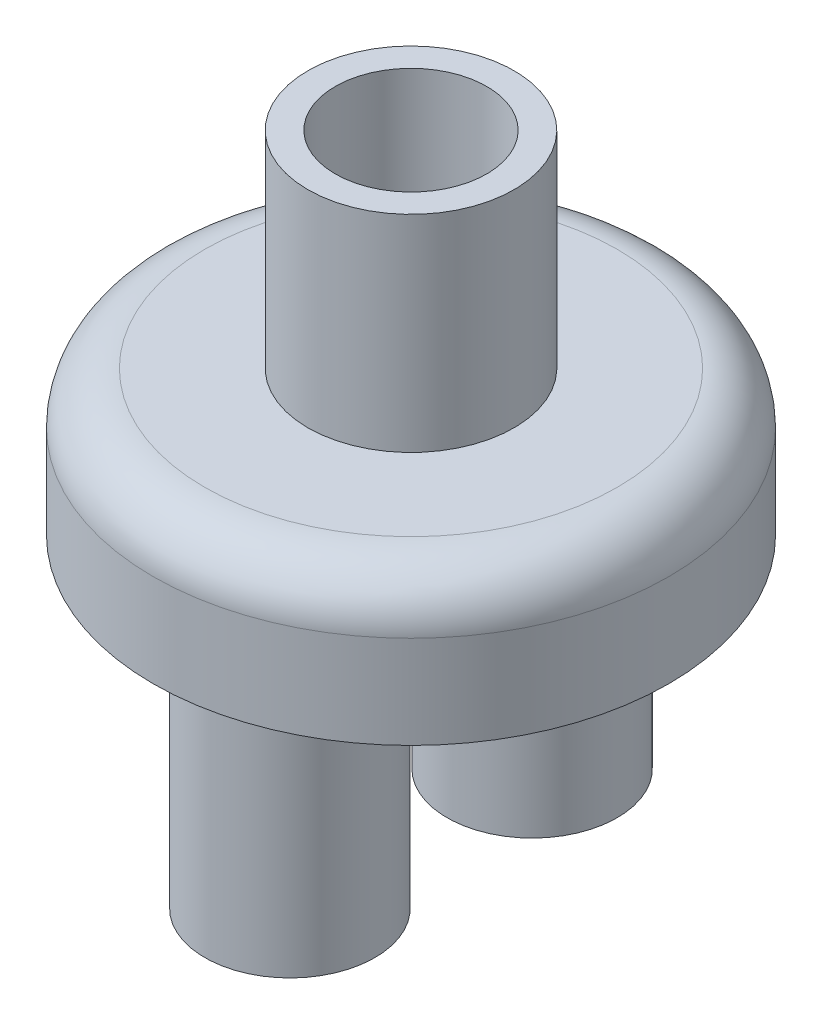
ISO-10303-21;
HEADER;
FILE_DESCRIPTION(('STEP AP214'),'2;1');
FILE_NAME('part.step','',(''),(''),'','','');
FILE_SCHEMA(('AUTOMOTIVE_DESIGN { 1 0 10303 214 1 1 1 1 }'));
ENDSEC;
DATA;
#1=APPLICATION_CONTEXT('core data for automotive mechanical design processes');
#2=APPLICATION_PROTOCOL_DEFINITION('international standard','automotive_design',2000,#1);
#3=PRODUCT_CONTEXT('',#1,'mechanical');
#4=PRODUCT('Part','Part','',(#3));
#5=PRODUCT_RELATED_PRODUCT_CATEGORY('part','',(#4));
#6=PRODUCT_DEFINITION_FORMATION('','',#4);
#7=PRODUCT_DEFINITION_CONTEXT('part definition',#1,'design');
#8=PRODUCT_DEFINITION('design','',#6,#7);
#9=PRODUCT_DEFINITION_SHAPE('','',#8);
#10=(LENGTH_UNIT() NAMED_UNIT(*) SI_UNIT(.MILLI.,.METRE.));
#11=(NAMED_UNIT(*) PLANE_ANGLE_UNIT() SI_UNIT($,.RADIAN.));
#12=(NAMED_UNIT(*) SI_UNIT($,.STERADIAN.) SOLID_ANGLE_UNIT());
#13=UNCERTAINTY_MEASURE_WITH_UNIT(LENGTH_MEASURE(1.E-05),#10,'distance_accuracy_value','');
#14=(GEOMETRIC_REPRESENTATION_CONTEXT(3) GLOBAL_UNCERTAINTY_ASSIGNED_CONTEXT((#13)) GLOBAL_UNIT_ASSIGNED_CONTEXT((#10,
#11,#12)) REPRESENTATION_CONTEXT('',''));
#15=CARTESIAN_POINT('',(0.,0.,0.));
#16=DIRECTION('',(0.,0.,1.));
#17=DIRECTION('',(1.,0.,0.));
#18=AXIS2_PLACEMENT_3D('',#15,#16,#17);
#19=CARTESIAN_POINT('',(0.,-22.,0.));
#20=DIRECTION('',(0.,1.,0.));
#21=DIRECTION('',(0.,0.,1.));
#22=AXIS2_PLACEMENT_3D('',#19,#20,#21);
#23=CYLINDRICAL_SURFACE('',#22,25.);
#24=CARTESIAN_POINT('',(0.,-5.,0.));
#25=DIRECTION('',(0.,-1.,0.));
#26=DIRECTION('',(0.,0.,-1.));
#27=AXIS2_PLACEMENT_3D('',#24,#25,#26);
#28=CIRCLE('',#27,25.);
#29=CARTESIAN_POINT('',(0.,-5.,-25.));
#30=VERTEX_POINT('',#29);
#31=EDGE_CURVE('E38',#30,#30,#28,.T.);
#32=ORIENTED_EDGE('',*,*,#31,.T.);
#33=EDGE_LOOP('',(#32));
#34=FACE_BOUND('',#33,.T.);
#35=CARTESIAN_POINT('',(0.,-14.,0.));
#36=DIRECTION('',(0.,-1.,0.));
#37=DIRECTION('',(0.,0.,-1.));
#38=AXIS2_PLACEMENT_3D('',#35,#36,#37);
#39=CIRCLE('',#38,25.);
#40=CARTESIAN_POINT('',(0.,-14.,-25.));
#41=VERTEX_POINT('',#40);
#42=EDGE_CURVE('E77',#41,#41,#39,.T.);
#43=ORIENTED_EDGE('',*,*,#42,.F.);
#44=EDGE_LOOP('',(#43));
#45=FACE_BOUND('',#44,.T.);
#46=ADVANCED_FACE('F31',(#34,#45),#23,.T.);
#47=CARTESIAN_POINT('',(0.,20.,0.));
#48=DIRECTION('',(0.,-1.,0.));
#49=DIRECTION('',(0.,0.,-1.));
#50=AXIS2_PLACEMENT_3D('',#47,#48,#49);
#51=CYLINDRICAL_SURFACE('',#50,10.);
#52=CARTESIAN_POINT('',(0.,20.,0.));
#53=DIRECTION('',(0.,1.,0.));
#54=DIRECTION('',(0.,0.,1.));
#55=AXIS2_PLACEMENT_3D('',#52,#53,#54);
#56=CIRCLE('',#55,10.);
#57=CARTESIAN_POINT('',(0.,20.,10.));
#58=VERTEX_POINT('',#57);
#59=EDGE_CURVE('E42',#58,#58,#56,.T.);
#60=ORIENTED_EDGE('',*,*,#59,.F.);
#61=EDGE_LOOP('',(#60));
#62=FACE_BOUND('',#61,.T.);
#63=CARTESIAN_POINT('',(0.,0.,0.));
#64=DIRECTION('',(0.,1.,0.));
#65=DIRECTION('',(0.,0.,1.));
#66=AXIS2_PLACEMENT_3D('',#63,#64,#65);
#67=CIRCLE('',#66,10.);
#68=CARTESIAN_POINT('',(0.,0.,10.));
#69=VERTEX_POINT('',#68);
#70=EDGE_CURVE('E46',#69,#69,#67,.T.);
#71=ORIENTED_EDGE('',*,*,#70,.T.);
#72=EDGE_LOOP('',(#71));
#73=FACE_BOUND('',#72,.T.);
#74=ADVANCED_FACE('F102',(#62,#73),#51,.T.);
#75=CARTESIAN_POINT('',(0.,20.,0.));
#76=DIRECTION('',(0.,1.,0.));
#77=DIRECTION('',(0.,0.,1.));
#78=AXIS2_PLACEMENT_3D('',#75,#76,#77);
#79=PLANE('',#78);
#80=CARTESIAN_POINT('',(0.,20.,0.));
#81=DIRECTION('',(0.,1.,0.));
#82=DIRECTION('',(0.,0.,1.));
#83=AXIS2_PLACEMENT_3D('',#80,#81,#82);
#84=CIRCLE('',#83,7.35);
#85=CARTESIAN_POINT('',(0.,20.,7.35));
#86=VERTEX_POINT('',#85);
#87=EDGE_CURVE('E55',#86,#86,#84,.T.);
#88=ORIENTED_EDGE('',*,*,#87,.F.);
#89=EDGE_LOOP('',(#88));
#90=FACE_BOUND('',#89,.T.);
#91=ORIENTED_EDGE('',*,*,#59,.T.);
#92=EDGE_LOOP('',(#91));
#93=FACE_BOUND('',#92,.T.);
#94=ADVANCED_FACE('F107',(#90,#93),#79,.T.);
#95=CARTESIAN_POINT('',(0.,0.,0.));
#96=DIRECTION('',(0.,-1.,0.));
#97=DIRECTION('',(0.,0.,-1.));
#98=AXIS2_PLACEMENT_3D('',#95,#96,#97);
#99=PLANE('',#98);
#100=CARTESIAN_POINT('',(0.,0.,0.));
#101=DIRECTION('',(0.,-1.,0.));
#102=DIRECTION('',(0.,0.,-1.));
#103=AXIS2_PLACEMENT_3D('',#100,#101,#102);
#104=CIRCLE('',#103,20.);
#105=CARTESIAN_POINT('',(0.,0.,-20.));
#106=VERTEX_POINT('',#105);
#107=EDGE_CURVE('E10',#106,#106,#104,.F.);
#108=ORIENTED_EDGE('',*,*,#107,.T.);
#109=EDGE_LOOP('',(#108));
#110=FACE_BOUND('',#109,.T.);
#111=ORIENTED_EDGE('',*,*,#70,.F.);
#112=EDGE_LOOP('',(#111));
#113=FACE_BOUND('',#112,.T.);
#114=ADVANCED_FACE('F111',(#110,#113),#99,.F.);
#115=CARTESIAN_POINT('',(0.,-5.,0.));
#116=DIRECTION('',(0.,-1.,0.));
#117=DIRECTION('',(0.,0.,-1.));
#118=AXIS2_PLACEMENT_3D('',#115,#116,#117);
#119=TOROIDAL_SURFACE('',#118,20.,5.);
#120=ORIENTED_EDGE('',*,*,#107,.F.);
#121=EDGE_LOOP('',(#120));
#122=FACE_BOUND('',#121,.T.);
#123=ORIENTED_EDGE('',*,*,#31,.F.);
#124=EDGE_LOOP('',(#123));
#125=FACE_BOUND('',#124,.T.);
#126=ADVANCED_FACE('F33',(#122,#125),#119,.T.);
#127=CARTESIAN_POINT('',(0.,0.,0.));
#128=DIRECTION('',(0.,1.,0.));
#129=DIRECTION('',(0.,0.,1.));
#130=AXIS2_PLACEMENT_3D('',#127,#128,#129);
#131=CYLINDRICAL_SURFACE('',#130,7.35);
#132=CARTESIAN_POINT('',(0.,0.,0.));
#133=DIRECTION('',(0.,1.,0.));
#134=DIRECTION('',(0.,0.,1.));
#135=AXIS2_PLACEMENT_3D('',#132,#133,#134);
#136=CIRCLE('',#135,7.35);
#137=CARTESIAN_POINT('',(0.,0.,7.35));
#138=VERTEX_POINT('',#137);
#139=EDGE_CURVE('E54',#138,#138,#136,.T.);
#140=ORIENTED_EDGE('',*,*,#139,.F.);
#141=EDGE_LOOP('',(#140));
#142=FACE_BOUND('',#141,.T.);
#143=ORIENTED_EDGE('',*,*,#87,.T.);
#144=EDGE_LOOP('',(#143));
#145=FACE_BOUND('',#144,.T.);
#146=ADVANCED_FACE('F125',(#142,#145),#131,.F.);
#147=CARTESIAN_POINT('',(0.,0.,0.));
#148=DIRECTION('',(0.,1.,0.));
#149=DIRECTION('',(0.,0.,1.));
#150=AXIS2_PLACEMENT_3D('',#147,#148,#149);
#151=PLANE('',#150);
#152=ORIENTED_EDGE('',*,*,#139,.T.);
#153=EDGE_LOOP('',(#152));
#154=FACE_BOUND('',#153,.T.);
#155=ADVANCED_FACE('F97',(#154),#151,.T.);
#156=CARTESIAN_POINT('',(0.,-14.,0.));
#157=DIRECTION('',(0.,-1.,0.));
#158=DIRECTION('',(0.,0.,-1.));
#159=AXIS2_PLACEMENT_3D('',#156,#157,#158);
#160=PLANE('',#159);
#161=CARTESIAN_POINT('',(0.,-14.,0.));
#162=DIRECTION('',(0.,-1.,0.));
#163=DIRECTION('',(0.,0.,-1.));
#164=AXIS2_PLACEMENT_3D('',#161,#162,#163);
#165=CIRCLE('',#164,20.5);
#166=CARTESIAN_POINT('',(0.,-14.,-20.5));
#167=VERTEX_POINT('',#166);
#168=EDGE_CURVE('E87',#167,#167,#165,.T.);
#169=ORIENTED_EDGE('',*,*,#168,.F.);
#170=EDGE_LOOP('',(#169));
#171=FACE_BOUND('',#170,.T.);
#172=ORIENTED_EDGE('',*,*,#42,.T.);
#173=EDGE_LOOP('',(#172));
#174=FACE_BOUND('',#173,.T.);
#175=ADVANCED_FACE('F93',(#171,#174),#160,.T.);
#176=CARTESIAN_POINT('',(0.,-9.5,11.7482591032129));
#177=DIRECTION('',(0.,-1.,0.));
#178=DIRECTION('',(0.,0.,-1.));
#179=AXIS2_PLACEMENT_3D('',#176,#177,#178);
#180=PLANE('',#179);
#181=CARTESIAN_POINT('',(0.,-9.5,11.7482591032129));
#182=DIRECTION('',(0.,-1.,0.));
#183=DIRECTION('',(0.,0.,-1.));
#184=AXIS2_PLACEMENT_3D('',#181,#182,#183);
#185=CIRCLE('',#184,4.5);
#186=CARTESIAN_POINT('',(0.,-9.5,7.24825910321292));
#187=VERTEX_POINT('',#186);
#188=EDGE_CURVE('E70',#187,#187,#185,.T.);
#189=ORIENTED_EDGE('',*,*,#188,.T.);
#190=EDGE_LOOP('',(#189));
#191=FACE_BOUND('',#190,.T.);
#192=ADVANCED_FACE('F96',(#191),#180,.T.);
#193=CARTESIAN_POINT('',(0.,-9.5,-11.7482591032129));
#194=DIRECTION('',(0.,-1.,0.));
#195=DIRECTION('',(0.,0.,-1.));
#196=AXIS2_PLACEMENT_3D('',#193,#194,#195);
#197=PLANE('',#196);
#198=CARTESIAN_POINT('',(0.,-9.5,-11.7482591032129));
#199=DIRECTION('',(0.,-1.,0.));
#200=DIRECTION('',(0.,0.,-1.));
#201=AXIS2_PLACEMENT_3D('',#198,#199,#200);
#202=CIRCLE('',#201,4.5);
#203=CARTESIAN_POINT('',(0.,-9.5,-16.2482591032129));
#204=VERTEX_POINT('',#203);
#205=EDGE_CURVE('E76',#204,#204,#202,.T.);
#206=ORIENTED_EDGE('',*,*,#205,.T.);
#207=EDGE_LOOP('',(#206));
#208=FACE_BOUND('',#207,.T.);
#209=ADVANCED_FACE('F201',(#208),#197,.T.);
#210=CARTESIAN_POINT('',(0.,-9.5,11.7482591032129));
#211=DIRECTION('',(0.,-1.,0.));
#212=DIRECTION('',(0.,0.,-1.));
#213=AXIS2_PLACEMENT_3D('',#210,#211,#212);
#214=CYLINDRICAL_SURFACE('',#213,4.5);
#215=ORIENTED_EDGE('',*,*,#188,.F.);
#216=EDGE_LOOP('',(#215));
#217=FACE_BOUND('',#216,.T.);
#218=CARTESIAN_POINT('',(0.,-39.5,11.7482591032129));
#219=DIRECTION('',(0.,-1.,0.));
#220=DIRECTION('',(0.,0.,-1.));
#221=AXIS2_PLACEMENT_3D('',#218,#219,#220);
#222=CIRCLE('',#221,4.5);
#223=CARTESIAN_POINT('',(0.,-39.5,7.24825910321292));
#224=VERTEX_POINT('',#223);
#225=EDGE_CURVE('E80',#224,#224,#222,.T.);
#226=ORIENTED_EDGE('',*,*,#225,.T.);
#227=EDGE_LOOP('',(#226));
#228=FACE_BOUND('',#227,.T.);
#229=ADVANCED_FACE('F192',(#217,#228),#214,.F.);
#230=CARTESIAN_POINT('',(0.,-9.5,-11.7482591032129));
#231=DIRECTION('',(0.,-1.,0.));
#232=DIRECTION('',(0.,0.,-1.));
#233=AXIS2_PLACEMENT_3D('',#230,#231,#232);
#234=CYLINDRICAL_SURFACE('',#233,4.5);
#235=ORIENTED_EDGE('',*,*,#205,.F.);
#236=EDGE_LOOP('',(#235));
#237=FACE_BOUND('',#236,.T.);
#238=CARTESIAN_POINT('',(0.,-39.5,-11.7482591032129));
#239=DIRECTION('',(0.,-1.,0.));
#240=DIRECTION('',(0.,0.,-1.));
#241=AXIS2_PLACEMENT_3D('',#238,#239,#240);
#242=CIRCLE('',#241,4.5);
#243=CARTESIAN_POINT('',(0.,-39.5,-16.2482591032129));
#244=VERTEX_POINT('',#243);
#245=EDGE_CURVE('E73',#244,#244,#242,.T.);
#246=ORIENTED_EDGE('',*,*,#245,.T.);
#247=EDGE_LOOP('',(#246));
#248=FACE_BOUND('',#247,.T.);
#249=ADVANCED_FACE('F185',(#237,#248),#234,.F.);
#250=CARTESIAN_POINT('',(0.,-39.5,11.7482591032129));
#251=DIRECTION('',(0.,-1.,0.));
#252=DIRECTION('',(0.,0.,-1.));
#253=AXIS2_PLACEMENT_3D('',#250,#251,#252);
#254=PLANE('',#253);
#255=ORIENTED_EDGE('',*,*,#225,.F.);
#256=EDGE_LOOP('',(#255));
#257=FACE_BOUND('',#256,.T.);
#258=CARTESIAN_POINT('',(0.,-39.5,11.7482591032129));
#259=DIRECTION('',(0.,-1.,0.));
#260=DIRECTION('',(0.,0.,-1.));
#261=AXIS2_PLACEMENT_3D('',#258,#259,#260);
#262=CIRCLE('',#261,8.25);
#263=CARTESIAN_POINT('',(0.,-39.5,3.49825910321292));
#264=VERTEX_POINT('',#263);
#265=EDGE_CURVE('E58',#264,#264,#262,.T.);
#266=ORIENTED_EDGE('',*,*,#265,.T.);
#267=EDGE_LOOP('',(#266));
#268=FACE_BOUND('',#267,.T.);
#269=ADVANCED_FACE('F177',(#257,#268),#254,.T.);
#270=CARTESIAN_POINT('',(0.,-39.5,-11.7482591032129));
#271=DIRECTION('',(0.,-1.,0.));
#272=DIRECTION('',(0.,0.,-1.));
#273=AXIS2_PLACEMENT_3D('',#270,#271,#272);
#274=PLANE('',#273);
#275=ORIENTED_EDGE('',*,*,#245,.F.);
#276=EDGE_LOOP('',(#275));
#277=FACE_BOUND('',#276,.T.);
#278=CARTESIAN_POINT('',(0.,-39.5,-11.7482591032129));
#279=DIRECTION('',(0.,-1.,0.));
#280=DIRECTION('',(0.,0.,-1.));
#281=AXIS2_PLACEMENT_3D('',#278,#279,#280);
#282=CIRCLE('',#281,8.25);
#283=CARTESIAN_POINT('',(0.,-39.5,-19.9982591032129));
#284=VERTEX_POINT('',#283);
#285=EDGE_CURVE('E64',#284,#284,#282,.T.);
#286=ORIENTED_EDGE('',*,*,#285,.T.);
#287=EDGE_LOOP('',(#286));
#288=FACE_BOUND('',#287,.T.);
#289=ADVANCED_FACE('F170',(#277,#288),#274,.T.);
#290=CARTESIAN_POINT('',(0.,-39.5,11.7482591032129));
#291=DIRECTION('',(0.,1.,0.));
#292=DIRECTION('',(0.,0.,1.));
#293=AXIS2_PLACEMENT_3D('',#290,#291,#292);
#294=CYLINDRICAL_SURFACE('',#293,8.25);
#295=ORIENTED_EDGE('',*,*,#265,.F.);
#296=EDGE_LOOP('',(#295));
#297=FACE_BOUND('',#296,.T.);
#298=CARTESIAN_POINT('',(0.,-2.,11.7482591032129));
#299=DIRECTION('',(0.,-1.,0.));
#300=DIRECTION('',(0.,0.,-1.));
#301=AXIS2_PLACEMENT_3D('',#298,#299,#300);
#302=CIRCLE('',#301,8.25);
#303=CARTESIAN_POINT('',(0.,-2.,3.49825910321292));
#304=VERTEX_POINT('',#303);
#305=EDGE_CURVE('E61',#304,#304,#302,.T.);
#306=ORIENTED_EDGE('',*,*,#305,.T.);
#307=EDGE_LOOP('',(#306));
#308=FACE_BOUND('',#307,.T.);
#309=ADVANCED_FACE('F162',(#297,#308),#294,.T.);
#310=CARTESIAN_POINT('',(0.,-39.5,-11.7482591032129));
#311=DIRECTION('',(0.,1.,0.));
#312=DIRECTION('',(0.,0.,1.));
#313=AXIS2_PLACEMENT_3D('',#310,#311,#312);
#314=CYLINDRICAL_SURFACE('',#313,8.25);
#315=ORIENTED_EDGE('',*,*,#285,.F.);
#316=EDGE_LOOP('',(#315));
#317=FACE_BOUND('',#316,.T.);
#318=CARTESIAN_POINT('',(0.,-2.,-11.7482591032129));
#319=DIRECTION('',(0.,-1.,0.));
#320=DIRECTION('',(0.,0.,-1.));
#321=AXIS2_PLACEMENT_3D('',#318,#319,#320);
#322=CIRCLE('',#321,8.25);
#323=CARTESIAN_POINT('',(0.,-2.,-19.9982591032129));
#324=VERTEX_POINT('',#323);
#325=EDGE_CURVE('E67',#324,#324,#322,.T.);
#326=ORIENTED_EDGE('',*,*,#325,.T.);
#327=EDGE_LOOP('',(#326));
#328=FACE_BOUND('',#327,.T.);
#329=ADVANCED_FACE('F141',(#317,#328),#314,.T.);
#330=CARTESIAN_POINT('',(0.,-2.,0.));
#331=DIRECTION('',(0.,-1.,0.));
#332=DIRECTION('',(0.,0.,-1.));
#333=AXIS2_PLACEMENT_3D('',#330,#331,#332);
#334=PLANE('',#333);
#335=ORIENTED_EDGE('',*,*,#325,.F.);
#336=EDGE_LOOP('',(#335));
#337=FACE_BOUND('',#336,.T.);
#338=ORIENTED_EDGE('',*,*,#305,.F.);
#339=EDGE_LOOP('',(#338));
#340=FACE_BOUND('',#339,.T.);
#341=CARTESIAN_POINT('',(0.,-2.,0.));
#342=DIRECTION('',(0.,-1.,0.));
#343=DIRECTION('',(0.,0.,-1.));
#344=AXIS2_PLACEMENT_3D('',#341,#342,#343);
#345=CIRCLE('',#344,20.5);
#346=CARTESIAN_POINT('',(0.,-2.,-20.5));
#347=VERTEX_POINT('',#346);
#348=EDGE_CURVE('E50',#347,#347,#345,.T.);
#349=ORIENTED_EDGE('',*,*,#348,.T.);
#350=EDGE_LOOP('',(#349));
#351=FACE_BOUND('',#350,.T.);
#352=ADVANCED_FACE('F139',(#337,#340,#351),#334,.T.);
#353=CARTESIAN_POINT('',(0.,-2.,0.));
#354=DIRECTION('',(0.,-1.,0.));
#355=DIRECTION('',(0.,0.,-1.));
#356=AXIS2_PLACEMENT_3D('',#353,#354,#355);
#357=CYLINDRICAL_SURFACE('',#356,20.5);
#358=ORIENTED_EDGE('',*,*,#348,.F.);
#359=EDGE_LOOP('',(#358));
#360=FACE_BOUND('',#359,.T.);
#361=ORIENTED_EDGE('',*,*,#168,.T.);
#362=EDGE_LOOP('',(#361));
#363=FACE_BOUND('',#362,.T.);
#364=ADVANCED_FACE('F91',(#360,#363),#357,.F.);
#365=CLOSED_SHELL('',(#46,#74,#94,#114,#126,#146,#155,#175,#192,#209,#229,#249,#269,#289,#309,
#329,#352,#364));
#366=MANIFOLD_SOLID_BREP('B2',#365);
#367=ADVANCED_BREP_SHAPE_REPRESENTATION('',(#18,#366),#14);
#368=SHAPE_DEFINITION_REPRESENTATION(#9,#367);
ENDSEC;
END-ISO-10303-21;
